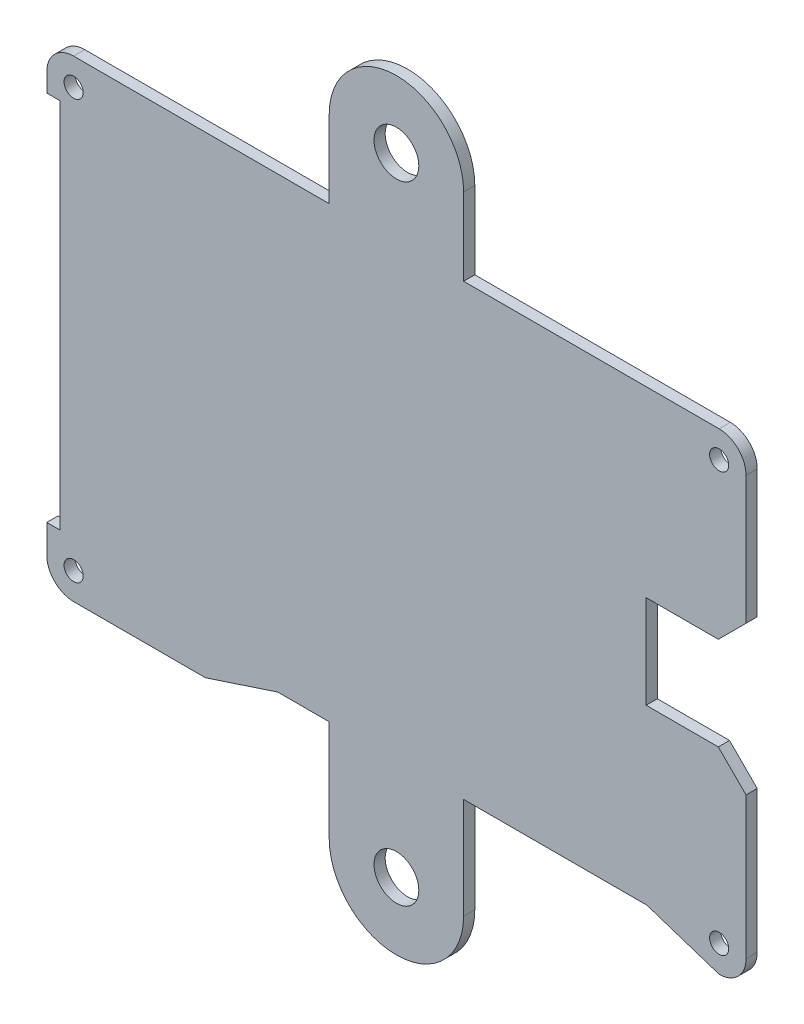
ISO-10303-21;
HEADER;
FILE_DESCRIPTION(('STEP AP214'),'2;1');
FILE_NAME('part.step','',(''),(''),'','','');
FILE_SCHEMA(('AUTOMOTIVE_DESIGN { 1 0 10303 214 1 1 1 1 }'));
ENDSEC;
DATA;
#1=APPLICATION_CONTEXT('core data for automotive mechanical design processes');
#2=APPLICATION_PROTOCOL_DEFINITION('international standard','automotive_design',2000,#1);
#3=PRODUCT_CONTEXT('',#1,'mechanical');
#4=PRODUCT('Part','Part','',(#3));
#5=PRODUCT_RELATED_PRODUCT_CATEGORY('part','',(#4));
#6=PRODUCT_DEFINITION_FORMATION('','',#4);
#7=PRODUCT_DEFINITION_CONTEXT('part definition',#1,'design');
#8=PRODUCT_DEFINITION('design','',#6,#7);
#9=PRODUCT_DEFINITION_SHAPE('','',#8);
#10=(LENGTH_UNIT() NAMED_UNIT(*) SI_UNIT(.MILLI.,.METRE.));
#11=(NAMED_UNIT(*) PLANE_ANGLE_UNIT() SI_UNIT($,.RADIAN.));
#12=(NAMED_UNIT(*) SI_UNIT($,.STERADIAN.) SOLID_ANGLE_UNIT());
#13=UNCERTAINTY_MEASURE_WITH_UNIT(LENGTH_MEASURE(1.E-05),#10,'distance_accuracy_value','');
#14=(GEOMETRIC_REPRESENTATION_CONTEXT(3) GLOBAL_UNCERTAINTY_ASSIGNED_CONTEXT((#13)) GLOBAL_UNIT_ASSIGNED_CONTEXT((#10,
#11,#12)) REPRESENTATION_CONTEXT('',''));
#15=CARTESIAN_POINT('',(0.,0.,0.));
#16=DIRECTION('',(0.,0.,1.));
#17=DIRECTION('',(1.,0.,0.));
#18=AXIS2_PLACEMENT_3D('',#15,#16,#17);
#19=CARTESIAN_POINT('',(-368.3165,91.1883,1.5875));
#20=DIRECTION('',(0.,1.,0.));
#21=DIRECTION('',(-1.,0.,0.));
#22=AXIS2_PLACEMENT_3D('',#19,#20,#21);
#23=PLANE('',#22);
#24=DIRECTION('',(0.,0.,1.));
#25=VECTOR('',#24,1.);
#26=CARTESIAN_POINT('',(-361.0272,91.1883,0.));
#27=LINE('',#26,#25);
#28=CARTESIAN_POINT('',(-361.0272,91.1883,0.));
#29=VERTEX_POINT('',#28);
#30=CARTESIAN_POINT('',(-361.0272,91.1883,1.5875));
#31=VERTEX_POINT('',#30);
#32=EDGE_CURVE('E243',#29,#31,#27,.T.);
#33=ORIENTED_EDGE('',*,*,#32,.T.);
#34=DIRECTION('',(1.,0.,0.));
#35=VECTOR('',#34,1.);
#36=CARTESIAN_POINT('',(-368.3165,91.1883,1.5875));
#37=LINE('',#36,#35);
#38=CARTESIAN_POINT('',(-368.3165,91.1883,1.5875));
#39=VERTEX_POINT('',#38);
#40=EDGE_CURVE('E365',#39,#31,#37,.T.);
#41=ORIENTED_EDGE('',*,*,#40,.F.);
#42=DIRECTION('',(0.,0.,-1.));
#43=VECTOR('',#42,1.);
#44=CARTESIAN_POINT('',(-368.3165,91.1883,1.5875));
#45=LINE('',#44,#43);
#46=CARTESIAN_POINT('',(-368.3165,91.1883,0.));
#47=VERTEX_POINT('',#46);
#48=EDGE_CURVE('E425',#39,#47,#45,.T.);
#49=ORIENTED_EDGE('',*,*,#48,.T.);
#50=DIRECTION('',(1.,0.,0.));
#51=VECTOR('',#50,1.);
#52=CARTESIAN_POINT('',(-368.3165,91.1883,0.));
#53=LINE('',#52,#51);
#54=EDGE_CURVE('E412',#47,#29,#53,.T.);
#55=ORIENTED_EDGE('',*,*,#54,.T.);
#56=EDGE_LOOP('',(#33,#41,#49,#55));
#57=FACE_BOUND('',#56,.T.);
#58=ADVANCED_FACE('F35',(#57),#23,.F.);
#59=CARTESIAN_POINT('',(-305.7573,154.7804,1.5875));
#60=DIRECTION('',(0.,-1.,0.));
#61=DIRECTION('',(1.,0.,0.));
#62=AXIS2_PLACEMENT_3D('',#59,#60,#61);
#63=PLANE('',#62);
#64=DIRECTION('',(0.,0.,1.));
#65=VECTOR('',#64,1.);
#66=CARTESIAN_POINT('',(-361.0272,154.7804,0.));
#67=LINE('',#66,#65);
#68=CARTESIAN_POINT('',(-361.0272,154.7804,0.));
#69=VERTEX_POINT('',#68);
#70=CARTESIAN_POINT('',(-361.0272,154.7804,1.5875));
#71=VERTEX_POINT('',#70);
#72=EDGE_CURVE('E58',#69,#71,#67,.T.);
#73=ORIENTED_EDGE('',*,*,#72,.F.);
#74=DIRECTION('',(-1.,0.,0.));
#75=VECTOR('',#74,1.);
#76=CARTESIAN_POINT('',(-305.7573,154.7804,0.));
#77=LINE('',#76,#75);
#78=CARTESIAN_POINT('',(-397.247125,154.7804,0.));
#79=VERTEX_POINT('',#78);
#80=EDGE_CURVE('E389',#69,#79,#77,.T.);
#81=ORIENTED_EDGE('',*,*,#80,.T.);
#82=DIRECTION('',(0.,0.,-1.));
#83=VECTOR('',#82,1.);
#84=CARTESIAN_POINT('',(-397.247125,154.7804,1.5875));
#85=LINE('',#84,#83);
#86=CARTESIAN_POINT('',(-397.247125,154.7804,1.5875));
#87=VERTEX_POINT('',#86);
#88=EDGE_CURVE('E452',#87,#79,#85,.T.);
#89=ORIENTED_EDGE('',*,*,#88,.F.);
#90=DIRECTION('',(-1.,0.,0.));
#91=VECTOR('',#90,1.);
#92=CARTESIAN_POINT('',(-305.7573,154.7804,1.5875));
#93=LINE('',#92,#91);
#94=EDGE_CURVE('E342',#71,#87,#93,.T.);
#95=ORIENTED_EDGE('',*,*,#94,.F.);
#96=EDGE_LOOP('',(#73,#81,#89,#95));
#97=FACE_BOUND('',#96,.T.);
#98=ADVANCED_FACE('F568',(#97),#63,.F.);
#99=CARTESIAN_POINT('',(-305.7573,150.9704,1.5875));
#100=DIRECTION('',(0.,0.,1.));
#101=DIRECTION('',(1.,0.,0.));
#102=AXIS2_PLACEMENT_3D('',#99,#100,#101);
#103=PLANE('',#102);
#104=CARTESIAN_POINT('',(-397.247125,150.9704,1.5875));
#105=DIRECTION('',(0.,0.,1.));
#106=DIRECTION('',(1.,0.,0.));
#107=AXIS2_PLACEMENT_3D('',#104,#105,#106);
#108=CIRCLE('',#107,1.35590040587868);
#109=CARTESIAN_POINT('',(-395.891224594121,150.9704,1.5875));
#110=VERTEX_POINT('',#109);
#111=EDGE_CURVE('E306',#110,#110,#108,.T.);
#112=ORIENTED_EDGE('',*,*,#111,.F.);
#113=EDGE_LOOP('',(#112));
#114=FACE_BOUND('',#113,.T.);
#115=CARTESIAN_POINT('',(-305.7573,91.6317,1.5875));
#116=DIRECTION('',(0.,0.,1.));
#117=DIRECTION('',(1.,0.,0.));
#118=AXIS2_PLACEMENT_3D('',#115,#116,#117);
#119=CIRCLE('',#118,1.35590040587868);
#120=CARTESIAN_POINT('',(-304.401399594121,91.6317,1.5875));
#121=VERTEX_POINT('',#120);
#122=EDGE_CURVE('E318',#121,#121,#119,.T.);
#123=ORIENTED_EDGE('',*,*,#122,.F.);
#124=EDGE_LOOP('',(#123));
#125=FACE_BOUND('',#124,.T.);
#126=DIRECTION('',(0.,1.,0.));
#127=VECTOR('',#126,1.);
#128=CARTESIAN_POINT('',(-301.9473,91.6317,1.5875));
#129=LINE('',#128,#127);
#130=CARTESIAN_POINT('',(-301.9473,91.6317,1.5875));
#131=VERTEX_POINT('',#130);
#132=CARTESIAN_POINT('',(-301.9473,111.74645,1.5875));
#133=VERTEX_POINT('',#132);
#134=EDGE_CURVE('E324',#131,#133,#129,.T.);
#135=ORIENTED_EDGE('',*,*,#134,.T.);
#136=DIRECTION('',(-0.70710678118655,0.707106781186545,0.));
#137=VECTOR('',#136,1.);
#138=CARTESIAN_POINT('',(-301.9473,111.74645,1.5875));
#139=LINE('',#138,#137);
#140=CARTESIAN_POINT('',(-305.87795,115.6771,1.5875));
#141=VERTEX_POINT('',#140);
#142=EDGE_CURVE('E327',#133,#141,#139,.T.);
#143=ORIENTED_EDGE('',*,*,#142,.T.);
#144=DIRECTION('',(-1.,0.,0.));
#145=VECTOR('',#144,1.);
#146=CARTESIAN_POINT('',(-305.87795,115.6771,1.5875));
#147=LINE('',#146,#145);
#148=CARTESIAN_POINT('',(-316.1078,115.6771,1.5875));
#149=VERTEX_POINT('',#148);
#150=EDGE_CURVE('E330',#141,#149,#147,.T.);
#151=ORIENTED_EDGE('',*,*,#150,.T.);
#152=DIRECTION('',(0.,1.,0.));
#153=VECTOR('',#152,1.);
#154=CARTESIAN_POINT('',(-316.1078,115.6771,1.5875));
#155=LINE('',#154,#153);
#156=CARTESIAN_POINT('',(-316.1078,128.8851,1.5875));
#157=VERTEX_POINT('',#156);
#158=EDGE_CURVE('E332',#149,#157,#155,.T.);
#159=ORIENTED_EDGE('',*,*,#158,.T.);
#160=DIRECTION('',(1.,0.,0.));
#161=VECTOR('',#160,1.);
#162=CARTESIAN_POINT('',(-316.1078,128.8851,1.5875));
#163=LINE('',#162,#161);
#164=CARTESIAN_POINT('',(-305.87795,128.8851,1.5875));
#165=VERTEX_POINT('',#164);
#166=EDGE_CURVE('E334',#157,#165,#163,.T.);
#167=ORIENTED_EDGE('',*,*,#166,.T.);
#168=DIRECTION('',(0.70710678118655,0.707106781186545,0.));
#169=VECTOR('',#168,1.);
#170=CARTESIAN_POINT('',(-305.87795,128.8851,1.5875));
#171=LINE('',#170,#169);
#172=CARTESIAN_POINT('',(-301.9473,132.81575,1.5875));
#173=VERTEX_POINT('',#172);
#174=EDGE_CURVE('E336',#165,#173,#171,.T.);
#175=ORIENTED_EDGE('',*,*,#174,.T.);
#176=DIRECTION('',(0.,1.,0.));
#177=VECTOR('',#176,1.);
#178=CARTESIAN_POINT('',(-301.9473,132.81575,1.5875));
#179=LINE('',#178,#177);
#180=CARTESIAN_POINT('',(-301.9473,150.9704,1.5875));
#181=VERTEX_POINT('',#180);
#182=EDGE_CURVE('E338',#173,#181,#179,.T.);
#183=ORIENTED_EDGE('',*,*,#182,.T.);
#184=CARTESIAN_POINT('',(-305.7573,150.9704,1.5875));
#185=DIRECTION('',(0.,0.,1.));
#186=DIRECTION('',(1.,0.,0.));
#187=AXIS2_PLACEMENT_3D('',#184,#185,#186);
#188=CIRCLE('',#187,3.80999999999994);
#189=CARTESIAN_POINT('',(-305.7573,154.7804,1.5875));
#190=VERTEX_POINT('',#189);
#191=EDGE_CURVE('E340',#181,#190,#188,.T.);
#192=ORIENTED_EDGE('',*,*,#191,.T.);
#193=CARTESIAN_POINT('',(-341.9772,154.7804,1.5875));
#194=VERTEX_POINT('',#193);
#195=EDGE_CURVE('E343',#190,#194,#93,.T.);
#196=ORIENTED_EDGE('',*,*,#195,.T.);
#197=DIRECTION('',(0.,1.,0.));
#198=VECTOR('',#197,1.);
#199=CARTESIAN_POINT('',(-341.9772,0.,1.5875));
#200=LINE('',#199,#198);
#201=CARTESIAN_POINT('',(-341.9772,165.75105,1.5875));
#202=VERTEX_POINT('',#201);
#203=EDGE_CURVE('E285',#194,#202,#200,.T.);
#204=ORIENTED_EDGE('',*,*,#203,.T.);
#205=CARTESIAN_POINT('',(-351.5022,165.75105,1.5875));
#206=DIRECTION('',(0.,0.,1.));
#207=DIRECTION('',(1.,0.,0.));
#208=AXIS2_PLACEMENT_3D('',#205,#206,#207);
#209=CIRCLE('',#208,9.52500000000001);
#210=CARTESIAN_POINT('',(-361.0272,165.75105,1.5875));
#211=VERTEX_POINT('',#210);
#212=EDGE_CURVE('E288',#202,#211,#209,.T.);
#213=ORIENTED_EDGE('',*,*,#212,.T.);
#214=DIRECTION('',(0.,1.,0.));
#215=VECTOR('',#214,1.);
#216=CARTESIAN_POINT('',(-361.0272,0.,1.5875));
#217=LINE('',#216,#215);
#218=EDGE_CURVE('E274',#71,#211,#217,.T.);
#219=ORIENTED_EDGE('',*,*,#218,.F.);
#220=ORIENTED_EDGE('',*,*,#94,.T.);
#221=CARTESIAN_POINT('',(-397.247125,150.9704,1.5875));
#222=DIRECTION('',(0.,0.,1.));
#223=DIRECTION('',(1.,0.,0.));
#224=AXIS2_PLACEMENT_3D('',#221,#222,#223);
#225=CIRCLE('',#224,3.81000000000001);
#226=CARTESIAN_POINT('',(-401.0571,150.956597848903,1.5875));
#227=VERTEX_POINT('',#226);
#228=EDGE_CURVE('E346',#87,#227,#225,.T.);
#229=ORIENTED_EDGE('',*,*,#228,.T.);
#230=DIRECTION('',(0.,-1.,0.));
#231=VECTOR('',#230,1.);
#232=CARTESIAN_POINT('',(-401.0571,150.956597848903,1.5875));
#233=LINE('',#232,#231);
#234=CARTESIAN_POINT('',(-401.0571,148.341,1.5875));
#235=VERTEX_POINT('',#234);
#236=EDGE_CURVE('E348',#227,#235,#233,.T.);
#237=ORIENTED_EDGE('',*,*,#236,.T.);
#238=DIRECTION('',(1.,0.,0.));
#239=VECTOR('',#238,1.);
#240=CARTESIAN_POINT('',(-401.0571,148.341,1.5875));
#241=LINE('',#240,#239);
#242=CARTESIAN_POINT('',(-399.1521,148.341,1.5875));
#243=VERTEX_POINT('',#242);
#244=EDGE_CURVE('E350',#235,#243,#241,.T.);
#245=ORIENTED_EDGE('',*,*,#244,.T.);
#246=DIRECTION('',(0.,-1.,0.));
#247=VECTOR('',#246,1.);
#248=CARTESIAN_POINT('',(-399.1521,148.341,1.5875));
#249=LINE('',#248,#247);
#250=CARTESIAN_POINT('',(-399.1521,95.6449,1.5875));
#251=VERTEX_POINT('',#250);
#252=EDGE_CURVE('E352',#243,#251,#249,.T.);
#253=ORIENTED_EDGE('',*,*,#252,.T.);
#254=DIRECTION('',(-1.,0.,0.));
#255=VECTOR('',#254,1.);
#256=CARTESIAN_POINT('',(-399.1521,95.6449,1.5875));
#257=LINE('',#256,#255);
#258=CARTESIAN_POINT('',(-401.0571,95.6449,1.5875));
#259=VERTEX_POINT('',#258);
#260=EDGE_CURVE('E354',#251,#259,#257,.T.);
#261=ORIENTED_EDGE('',*,*,#260,.T.);
#262=DIRECTION('',(0.,-1.,0.));
#263=VECTOR('',#262,1.);
#264=CARTESIAN_POINT('',(-401.0571,95.6449,1.5875));
#265=LINE('',#264,#263);
#266=CARTESIAN_POINT('',(-401.0571,91.6593041663556,1.5875));
#267=VERTEX_POINT('',#266);
#268=EDGE_CURVE('E356',#259,#267,#265,.T.);
#269=ORIENTED_EDGE('',*,*,#268,.T.);
#270=CARTESIAN_POINT('',(-397.2472,91.6317,1.5875));
#271=DIRECTION('',(0.,0.,1.));
#272=DIRECTION('',(1.,0.,0.));
#273=AXIS2_PLACEMENT_3D('',#270,#271,#272);
#274=CIRCLE('',#273,3.81);
#275=CARTESIAN_POINT('',(-397.2472,87.8217,1.5875));
#276=VERTEX_POINT('',#275);
#277=EDGE_CURVE('E358',#267,#276,#274,.T.);
#278=ORIENTED_EDGE('',*,*,#277,.T.);
#279=DIRECTION('',(1.,0.,0.));
#280=VECTOR('',#279,1.);
#281=CARTESIAN_POINT('',(-397.2472,87.8217,1.5875));
#282=LINE('',#281,#280);
#283=CARTESIAN_POINT('',(-378.5565,87.8217,1.5875));
#284=VERTEX_POINT('',#283);
#285=EDGE_CURVE('E360',#276,#284,#282,.T.);
#286=ORIENTED_EDGE('',*,*,#285,.T.);
#287=DIRECTION('',(0.949975924247208,0.312323139313538,0.));
#288=VECTOR('',#287,1.);
#289=CARTESIAN_POINT('',(-378.5565,87.8217,1.5875));
#290=LINE('',#289,#288);
#291=EDGE_CURVE('E362',#284,#39,#290,.T.);
#292=ORIENTED_EDGE('',*,*,#291,.T.);
#293=ORIENTED_EDGE('',*,*,#40,.T.);
#294=DIRECTION('',(0.,1.,0.));
#295=VECTOR('',#294,1.);
#296=CARTESIAN_POINT('',(-361.0272,0.,1.5875));
#297=LINE('',#296,#295);
#298=CARTESIAN_POINT('',(-361.0272,76.85105,1.5875));
#299=VERTEX_POINT('',#298);
#300=EDGE_CURVE('E261',#299,#31,#297,.T.);
#301=ORIENTED_EDGE('',*,*,#300,.F.);
#302=CARTESIAN_POINT('',(-351.5022,76.85105,1.5875));
#303=DIRECTION('',(0.,0.,1.));
#304=DIRECTION('',(1.,0.,0.));
#305=AXIS2_PLACEMENT_3D('',#302,#303,#304);
#306=CIRCLE('',#305,9.52500000000001);
#307=CARTESIAN_POINT('',(-341.9772,76.85105,1.5875));
#308=VERTEX_POINT('',#307);
#309=EDGE_CURVE('E233',#299,#308,#306,.T.);
#310=ORIENTED_EDGE('',*,*,#309,.T.);
#311=DIRECTION('',(0.,1.,0.));
#312=VECTOR('',#311,1.);
#313=CARTESIAN_POINT('',(-341.9772,0.,1.5875));
#314=LINE('',#313,#312);
#315=CARTESIAN_POINT('',(-341.9772,91.1883,1.5875));
#316=VERTEX_POINT('',#315);
#317=EDGE_CURVE('E50',#308,#316,#314,.T.);
#318=ORIENTED_EDGE('',*,*,#317,.T.);
#319=CARTESIAN_POINT('',(-315.9973,91.1883,1.5875));
#320=VERTEX_POINT('',#319);
#321=EDGE_CURVE('E364',#316,#320,#37,.T.);
#322=ORIENTED_EDGE('',*,*,#321,.T.);
#323=DIRECTION('',(0.949975924247207,-0.312323139313541,0.));
#324=VECTOR('',#323,1.);
#325=CARTESIAN_POINT('',(-315.9973,91.1883,1.5875));
#326=LINE('',#325,#324);
#327=CARTESIAN_POINT('',(-305.7573,87.8217,1.5875));
#328=VERTEX_POINT('',#327);
#329=EDGE_CURVE('E368',#320,#328,#326,.T.);
#330=ORIENTED_EDGE('',*,*,#329,.T.);
#331=CARTESIAN_POINT('',(-305.7573,91.6317,1.5875));
#332=DIRECTION('',(0.,0.,1.));
#333=DIRECTION('',(1.,0.,0.));
#334=AXIS2_PLACEMENT_3D('',#331,#332,#333);
#335=CIRCLE('',#334,3.81);
#336=EDGE_CURVE('E370',#328,#131,#335,.T.);
#337=ORIENTED_EDGE('',*,*,#336,.T.);
#338=EDGE_LOOP('',(#135,#143,#151,#159,#167,#175,#183,#192,#196,#204,#213,#219,#220,#229,#237,
#245,#253,#261,#269,#278,#286,#292,#293,#301,#310,#318,#322,#330,#337));
#339=FACE_BOUND('',#338,.T.);
#340=CARTESIAN_POINT('',(-305.7573,150.9704,1.5875));
#341=DIRECTION('',(0.,0.,1.));
#342=DIRECTION('',(1.,0.,0.));
#343=AXIS2_PLACEMENT_3D('',#340,#341,#342);
#344=CIRCLE('',#343,1.35590040587868);
#345=CARTESIAN_POINT('',(-304.401399594121,150.9704,1.5875));
#346=VERTEX_POINT('',#345);
#347=EDGE_CURVE('E312',#346,#346,#344,.T.);
#348=ORIENTED_EDGE('',*,*,#347,.F.);
#349=EDGE_LOOP('',(#348));
#350=FACE_BOUND('',#349,.T.);
#351=CARTESIAN_POINT('',(-397.2472,91.6317,1.5875));
#352=DIRECTION('',(0.,0.,1.));
#353=DIRECTION('',(1.,0.,0.));
#354=AXIS2_PLACEMENT_3D('',#351,#352,#353);
#355=CIRCLE('',#354,1.35590040587868);
#356=CARTESIAN_POINT('',(-395.891299594121,91.6317,1.5875));
#357=VERTEX_POINT('',#356);
#358=EDGE_CURVE('E300',#357,#357,#355,.T.);
#359=ORIENTED_EDGE('',*,*,#358,.F.);
#360=EDGE_LOOP('',(#359));
#361=FACE_BOUND('',#360,.T.);
#362=CARTESIAN_POINT('',(-351.5022,165.75105,1.5875));
#363=DIRECTION('',(0.,0.,1.));
#364=DIRECTION('',(1.,0.,0.));
#365=AXIS2_PLACEMENT_3D('',#362,#363,#364);
#366=CIRCLE('',#365,3.17499999999997);
#367=CARTESIAN_POINT('',(-348.3272,165.75105,1.5875));
#368=VERTEX_POINT('',#367);
#369=EDGE_CURVE('E266',#368,#368,#366,.T.);
#370=ORIENTED_EDGE('',*,*,#369,.F.);
#371=EDGE_LOOP('',(#370));
#372=FACE_BOUND('',#371,.T.);
#373=CARTESIAN_POINT('',(-351.5022,76.85105,1.5875));
#374=DIRECTION('',(0.,0.,1.));
#375=DIRECTION('',(1.,0.,0.));
#376=AXIS2_PLACEMENT_3D('',#373,#374,#375);
#377=CIRCLE('',#376,3.17499999999997);
#378=CARTESIAN_POINT('',(-348.3272,76.85105,1.5875));
#379=VERTEX_POINT('',#378);
#380=EDGE_CURVE('E258',#379,#379,#377,.T.);
#381=ORIENTED_EDGE('',*,*,#380,.F.);
#382=EDGE_LOOP('',(#381));
#383=FACE_BOUND('',#382,.T.);
#384=ADVANCED_FACE('F492',(#114,#125,#339,#350,#361,#372,#383),#103,.T.);
#385=CARTESIAN_POINT('',(-305.7573,150.9704,0.));
#386=DIRECTION('',(0.,0.,1.));
#387=DIRECTION('',(1.,0.,0.));
#388=AXIS2_PLACEMENT_3D('',#385,#386,#387);
#389=PLANE('',#388);
#390=CARTESIAN_POINT('',(-397.247125,150.9704,0.));
#391=DIRECTION('',(0.,0.,1.));
#392=DIRECTION('',(1.,0.,0.));
#393=AXIS2_PLACEMENT_3D('',#390,#391,#392);
#394=CIRCLE('',#393,1.35590040587868);
#395=CARTESIAN_POINT('',(-395.891224594121,150.9704,0.));
#396=VERTEX_POINT('',#395);
#397=EDGE_CURVE('E303',#396,#396,#394,.T.);
#398=ORIENTED_EDGE('',*,*,#397,.T.);
#399=EDGE_LOOP('',(#398));
#400=FACE_BOUND('',#399,.T.);
#401=CARTESIAN_POINT('',(-305.7573,91.6317,0.));
#402=DIRECTION('',(0.,0.,1.));
#403=DIRECTION('',(1.,0.,0.));
#404=AXIS2_PLACEMENT_3D('',#401,#402,#403);
#405=CIRCLE('',#404,1.35590040587868);
#406=CARTESIAN_POINT('',(-304.401399594121,91.6317,0.));
#407=VERTEX_POINT('',#406);
#408=EDGE_CURVE('E315',#407,#407,#405,.T.);
#409=ORIENTED_EDGE('',*,*,#408,.T.);
#410=EDGE_LOOP('',(#409));
#411=FACE_BOUND('',#410,.T.);
#412=DIRECTION('',(0.,1.,0.));
#413=VECTOR('',#412,1.);
#414=CARTESIAN_POINT('',(-301.9473,91.6317,0.));
#415=LINE('',#414,#413);
#416=CARTESIAN_POINT('',(-301.9473,91.6317,0.));
#417=VERTEX_POINT('',#416);
#418=CARTESIAN_POINT('',(-301.9473,111.74645,0.));
#419=VERTEX_POINT('',#418);
#420=EDGE_CURVE('E321',#417,#419,#415,.T.);
#421=ORIENTED_EDGE('',*,*,#420,.F.);
#422=CARTESIAN_POINT('',(-305.7573,91.6317,0.));
#423=DIRECTION('',(0.,0.,1.));
#424=DIRECTION('',(1.,0.,0.));
#425=AXIS2_PLACEMENT_3D('',#422,#423,#424);
#426=CIRCLE('',#425,3.81);
#427=CARTESIAN_POINT('',(-305.7573,87.8217,0.));
#428=VERTEX_POINT('',#427);
#429=EDGE_CURVE('E328',#428,#417,#426,.T.);
#430=ORIENTED_EDGE('',*,*,#429,.F.);
#431=DIRECTION('',(0.949975924247207,-0.312323139313541,0.));
#432=VECTOR('',#431,1.);
#433=CARTESIAN_POINT('',(-315.9973,91.1883,0.));
#434=LINE('',#433,#432);
#435=CARTESIAN_POINT('',(-315.9973,91.1883,0.));
#436=VERTEX_POINT('',#435);
#437=EDGE_CURVE('E414',#436,#428,#434,.T.);
#438=ORIENTED_EDGE('',*,*,#437,.F.);
#439=CARTESIAN_POINT('',(-341.9772,91.1883,0.));
#440=VERTEX_POINT('',#439);
#441=EDGE_CURVE('E411',#440,#436,#53,.T.);
#442=ORIENTED_EDGE('',*,*,#441,.F.);
#443=DIRECTION('',(0.,1.,0.));
#444=VECTOR('',#443,1.);
#445=CARTESIAN_POINT('',(-341.9772,0.,0.));
#446=LINE('',#445,#444);
#447=CARTESIAN_POINT('',(-341.9772,76.85105,0.));
#448=VERTEX_POINT('',#447);
#449=EDGE_CURVE('E237',#448,#440,#446,.T.);
#450=ORIENTED_EDGE('',*,*,#449,.F.);
#451=CARTESIAN_POINT('',(-351.5022,76.85105,0.));
#452=DIRECTION('',(0.,0.,1.));
#453=DIRECTION('',(1.,0.,0.));
#454=AXIS2_PLACEMENT_3D('',#451,#452,#453);
#455=CIRCLE('',#454,9.52500000000001);
#456=CARTESIAN_POINT('',(-361.0272,76.85105,0.));
#457=VERTEX_POINT('',#456);
#458=EDGE_CURVE('E232',#457,#448,#455,.T.);
#459=ORIENTED_EDGE('',*,*,#458,.F.);
#460=DIRECTION('',(0.,1.,0.));
#461=VECTOR('',#460,1.);
#462=CARTESIAN_POINT('',(-361.0272,0.,0.));
#463=LINE('',#462,#461);
#464=EDGE_CURVE('E240',#457,#29,#463,.T.);
#465=ORIENTED_EDGE('',*,*,#464,.T.);
#466=ORIENTED_EDGE('',*,*,#54,.F.);
#467=DIRECTION('',(0.949975924247208,0.312323139313538,0.));
#468=VECTOR('',#467,1.);
#469=CARTESIAN_POINT('',(-378.5565,87.8217,0.));
#470=LINE('',#469,#468);
#471=CARTESIAN_POINT('',(-378.5565,87.8217,0.));
#472=VERTEX_POINT('',#471);
#473=EDGE_CURVE('E409',#472,#47,#470,.T.);
#474=ORIENTED_EDGE('',*,*,#473,.F.);
#475=DIRECTION('',(1.,0.,0.));
#476=VECTOR('',#475,1.);
#477=CARTESIAN_POINT('',(-397.2472,87.8217,0.));
#478=LINE('',#477,#476);
#479=CARTESIAN_POINT('',(-397.2472,87.8217,0.));
#480=VERTEX_POINT('',#479);
#481=EDGE_CURVE('E407',#480,#472,#478,.T.);
#482=ORIENTED_EDGE('',*,*,#481,.F.);
#483=CARTESIAN_POINT('',(-397.2472,91.6317,0.));
#484=DIRECTION('',(0.,0.,1.));
#485=DIRECTION('',(1.,0.,0.));
#486=AXIS2_PLACEMENT_3D('',#483,#484,#485);
#487=CIRCLE('',#486,3.81);
#488=CARTESIAN_POINT('',(-401.0571,91.6593041663556,0.));
#489=VERTEX_POINT('',#488);
#490=EDGE_CURVE('E405',#489,#480,#487,.T.);
#491=ORIENTED_EDGE('',*,*,#490,.F.);
#492=DIRECTION('',(0.,-1.,0.));
#493=VECTOR('',#492,1.);
#494=CARTESIAN_POINT('',(-401.0571,95.6449,0.));
#495=LINE('',#494,#493);
#496=CARTESIAN_POINT('',(-401.0571,95.6449,0.));
#497=VERTEX_POINT('',#496);
#498=EDGE_CURVE('E403',#497,#489,#495,.T.);
#499=ORIENTED_EDGE('',*,*,#498,.F.);
#500=DIRECTION('',(-1.,0.,0.));
#501=VECTOR('',#500,1.);
#502=CARTESIAN_POINT('',(-399.1521,95.6449,0.));
#503=LINE('',#502,#501);
#504=CARTESIAN_POINT('',(-399.1521,95.6449,0.));
#505=VERTEX_POINT('',#504);
#506=EDGE_CURVE('E401',#505,#497,#503,.T.);
#507=ORIENTED_EDGE('',*,*,#506,.F.);
#508=DIRECTION('',(0.,-1.,0.));
#509=VECTOR('',#508,1.);
#510=CARTESIAN_POINT('',(-399.1521,148.341,0.));
#511=LINE('',#510,#509);
#512=CARTESIAN_POINT('',(-399.1521,148.341,0.));
#513=VERTEX_POINT('',#512);
#514=EDGE_CURVE('E399',#513,#505,#511,.T.);
#515=ORIENTED_EDGE('',*,*,#514,.F.);
#516=DIRECTION('',(1.,0.,0.));
#517=VECTOR('',#516,1.);
#518=CARTESIAN_POINT('',(-401.0571,148.341,0.));
#519=LINE('',#518,#517);
#520=CARTESIAN_POINT('',(-401.0571,148.341,0.));
#521=VERTEX_POINT('',#520);
#522=EDGE_CURVE('E397',#521,#513,#519,.T.);
#523=ORIENTED_EDGE('',*,*,#522,.F.);
#524=DIRECTION('',(0.,-1.,0.));
#525=VECTOR('',#524,1.);
#526=CARTESIAN_POINT('',(-401.0571,150.956597848903,0.));
#527=LINE('',#526,#525);
#528=CARTESIAN_POINT('',(-401.0571,150.956597848903,0.));
#529=VERTEX_POINT('',#528);
#530=EDGE_CURVE('E395',#529,#521,#527,.T.);
#531=ORIENTED_EDGE('',*,*,#530,.F.);
#532=CARTESIAN_POINT('',(-397.247125,150.9704,0.));
#533=DIRECTION('',(0.,0.,1.));
#534=DIRECTION('',(1.,0.,0.));
#535=AXIS2_PLACEMENT_3D('',#532,#533,#534);
#536=CIRCLE('',#535,3.81000000000001);
#537=EDGE_CURVE('E393',#79,#529,#536,.T.);
#538=ORIENTED_EDGE('',*,*,#537,.F.);
#539=ORIENTED_EDGE('',*,*,#80,.F.);
#540=DIRECTION('',(0.,1.,0.));
#541=VECTOR('',#540,1.);
#542=CARTESIAN_POINT('',(-361.0272,0.,0.));
#543=LINE('',#542,#541);
#544=CARTESIAN_POINT('',(-361.0272,165.75105,0.));
#545=VERTEX_POINT('',#544);
#546=EDGE_CURVE('E280',#69,#545,#543,.T.);
#547=ORIENTED_EDGE('',*,*,#546,.T.);
#548=CARTESIAN_POINT('',(-351.5022,165.75105,0.));
#549=DIRECTION('',(0.,0.,1.));
#550=DIRECTION('',(1.,0.,0.));
#551=AXIS2_PLACEMENT_3D('',#548,#549,#550);
#552=CIRCLE('',#551,9.52500000000001);
#553=CARTESIAN_POINT('',(-341.9772,165.75105,0.));
#554=VERTEX_POINT('',#553);
#555=EDGE_CURVE('E277',#554,#545,#552,.T.);
#556=ORIENTED_EDGE('',*,*,#555,.F.);
#557=DIRECTION('',(0.,1.,0.));
#558=VECTOR('',#557,1.);
#559=CARTESIAN_POINT('',(-341.9772,0.,0.));
#560=LINE('',#559,#558);
#561=CARTESIAN_POINT('',(-341.9772,154.7804,0.));
#562=VERTEX_POINT('',#561);
#563=EDGE_CURVE('E273',#562,#554,#560,.T.);
#564=ORIENTED_EDGE('',*,*,#563,.F.);
#565=CARTESIAN_POINT('',(-305.7573,154.7804,0.));
#566=VERTEX_POINT('',#565);
#567=EDGE_CURVE('E390',#566,#562,#77,.T.);
#568=ORIENTED_EDGE('',*,*,#567,.F.);
#569=CARTESIAN_POINT('',(-305.7573,150.9704,0.));
#570=DIRECTION('',(0.,0.,1.));
#571=DIRECTION('',(1.,0.,0.));
#572=AXIS2_PLACEMENT_3D('',#569,#570,#571);
#573=CIRCLE('',#572,3.80999999999994);
#574=CARTESIAN_POINT('',(-301.9473,150.9704,0.));
#575=VERTEX_POINT('',#574);
#576=EDGE_CURVE('E387',#575,#566,#573,.T.);
#577=ORIENTED_EDGE('',*,*,#576,.F.);
#578=DIRECTION('',(0.,1.,0.));
#579=VECTOR('',#578,1.);
#580=CARTESIAN_POINT('',(-301.9473,132.81575,0.));
#581=LINE('',#580,#579);
#582=CARTESIAN_POINT('',(-301.9473,132.81575,0.));
#583=VERTEX_POINT('',#582);
#584=EDGE_CURVE('E385',#583,#575,#581,.T.);
#585=ORIENTED_EDGE('',*,*,#584,.F.);
#586=DIRECTION('',(0.70710678118655,0.707106781186545,0.));
#587=VECTOR('',#586,1.);
#588=CARTESIAN_POINT('',(-305.87795,128.8851,0.));
#589=LINE('',#588,#587);
#590=CARTESIAN_POINT('',(-305.87795,128.8851,0.));
#591=VERTEX_POINT('',#590);
#592=EDGE_CURVE('E383',#591,#583,#589,.T.);
#593=ORIENTED_EDGE('',*,*,#592,.F.);
#594=DIRECTION('',(1.,0.,0.));
#595=VECTOR('',#594,1.);
#596=CARTESIAN_POINT('',(-316.1078,128.8851,0.));
#597=LINE('',#596,#595);
#598=CARTESIAN_POINT('',(-316.1078,128.8851,0.));
#599=VERTEX_POINT('',#598);
#600=EDGE_CURVE('E381',#599,#591,#597,.T.);
#601=ORIENTED_EDGE('',*,*,#600,.F.);
#602=DIRECTION('',(0.,1.,0.));
#603=VECTOR('',#602,1.);
#604=CARTESIAN_POINT('',(-316.1078,115.6771,0.));
#605=LINE('',#604,#603);
#606=CARTESIAN_POINT('',(-316.1078,115.6771,0.));
#607=VERTEX_POINT('',#606);
#608=EDGE_CURVE('E379',#607,#599,#605,.T.);
#609=ORIENTED_EDGE('',*,*,#608,.F.);
#610=DIRECTION('',(-1.,0.,0.));
#611=VECTOR('',#610,1.);
#612=CARTESIAN_POINT('',(-305.87795,115.6771,0.));
#613=LINE('',#612,#611);
#614=CARTESIAN_POINT('',(-305.87795,115.6771,0.));
#615=VERTEX_POINT('',#614);
#616=EDGE_CURVE('E377',#615,#607,#613,.T.);
#617=ORIENTED_EDGE('',*,*,#616,.F.);
#618=DIRECTION('',(-0.70710678118655,0.707106781186545,0.));
#619=VECTOR('',#618,1.);
#620=CARTESIAN_POINT('',(-301.9473,111.74645,0.));
#621=LINE('',#620,#619);
#622=EDGE_CURVE('E375',#419,#615,#621,.T.);
#623=ORIENTED_EDGE('',*,*,#622,.F.);
#624=EDGE_LOOP('',(#421,#430,#438,#442,#450,#459,#465,#466,#474,#482,#491,#499,#507,#515,#523,
#531,#538,#539,#547,#556,#564,#568,#577,#585,#593,#601,#609,#617,#623));
#625=FACE_BOUND('',#624,.T.);
#626=CARTESIAN_POINT('',(-305.7573,150.9704,0.));
#627=DIRECTION('',(0.,0.,1.));
#628=DIRECTION('',(1.,0.,0.));
#629=AXIS2_PLACEMENT_3D('',#626,#627,#628);
#630=CIRCLE('',#629,1.35590040587868);
#631=CARTESIAN_POINT('',(-304.401399594121,150.9704,0.));
#632=VERTEX_POINT('',#631);
#633=EDGE_CURVE('E309',#632,#632,#630,.T.);
#634=ORIENTED_EDGE('',*,*,#633,.T.);
#635=EDGE_LOOP('',(#634));
#636=FACE_BOUND('',#635,.T.);
#637=CARTESIAN_POINT('',(-397.2472,91.6317,0.));
#638=DIRECTION('',(0.,0.,1.));
#639=DIRECTION('',(1.,0.,0.));
#640=AXIS2_PLACEMENT_3D('',#637,#638,#639);
#641=CIRCLE('',#640,1.35590040587868);
#642=CARTESIAN_POINT('',(-395.891299594121,91.6317,0.));
#643=VERTEX_POINT('',#642);
#644=EDGE_CURVE('E295',#643,#643,#641,.T.);
#645=ORIENTED_EDGE('',*,*,#644,.T.);
#646=EDGE_LOOP('',(#645));
#647=FACE_BOUND('',#646,.T.);
#648=CARTESIAN_POINT('',(-351.5022,165.75105,0.));
#649=DIRECTION('',(0.,0.,1.));
#650=DIRECTION('',(1.,0.,0.));
#651=AXIS2_PLACEMENT_3D('',#648,#649,#650);
#652=CIRCLE('',#651,3.17499999999997);
#653=CARTESIAN_POINT('',(-348.3272,165.75105,0.));
#654=VERTEX_POINT('',#653);
#655=EDGE_CURVE('E270',#654,#654,#652,.T.);
#656=ORIENTED_EDGE('',*,*,#655,.T.);
#657=EDGE_LOOP('',(#656));
#658=FACE_BOUND('',#657,.T.);
#659=CARTESIAN_POINT('',(-351.5022,76.85105,0.));
#660=DIRECTION('',(0.,0.,1.));
#661=DIRECTION('',(1.,0.,0.));
#662=AXIS2_PLACEMENT_3D('',#659,#660,#661);
#663=CIRCLE('',#662,3.17499999999997);
#664=CARTESIAN_POINT('',(-348.3272,76.85105,0.));
#665=VERTEX_POINT('',#664);
#666=EDGE_CURVE('E247',#665,#665,#663,.T.);
#667=ORIENTED_EDGE('',*,*,#666,.T.);
#668=EDGE_LOOP('',(#667));
#669=FACE_BOUND('',#668,.T.);
#670=ADVANCED_FACE('F251',(#400,#411,#625,#636,#647,#658,#669),#389,.F.);
#671=CARTESIAN_POINT('',(-301.9473,91.6317,1.5875));
#672=DIRECTION('',(-1.,0.,0.));
#673=DIRECTION('',(0.,-1.,0.));
#674=AXIS2_PLACEMENT_3D('',#671,#672,#673);
#675=PLANE('',#674);
#676=ORIENTED_EDGE('',*,*,#420,.T.);
#677=DIRECTION('',(0.,0.,-1.));
#678=VECTOR('',#677,1.);
#679=CARTESIAN_POINT('',(-301.9473,111.74645,1.5875));
#680=LINE('',#679,#678);
#681=EDGE_CURVE('E11',#133,#419,#680,.T.);
#682=ORIENTED_EDGE('',*,*,#681,.F.);
#683=ORIENTED_EDGE('',*,*,#134,.F.);
#684=DIRECTION('',(0.,0.,-1.));
#685=VECTOR('',#684,1.);
#686=CARTESIAN_POINT('',(-301.9473,91.6317,1.5875));
#687=LINE('',#686,#685);
#688=EDGE_CURVE('E372',#131,#417,#687,.T.);
#689=ORIENTED_EDGE('',*,*,#688,.T.);
#690=EDGE_LOOP('',(#676,#682,#683,#689));
#691=FACE_BOUND('',#690,.T.);
#692=ADVANCED_FACE('F37',(#691),#675,.F.);
#693=CARTESIAN_POINT('',(-301.9473,111.74645,1.5875));
#694=DIRECTION('',(-0.707106781186545,-0.70710678118655,0.));
#695=DIRECTION('',(0.70710678118655,-0.707106781186545,0.));
#696=AXIS2_PLACEMENT_3D('',#693,#694,#695);
#697=PLANE('',#696);
#698=ORIENTED_EDGE('',*,*,#622,.T.);
#699=DIRECTION('',(0.,0.,-1.));
#700=VECTOR('',#699,1.);
#701=CARTESIAN_POINT('',(-305.87795,115.6771,1.5875));
#702=LINE('',#701,#700);
#703=EDGE_CURVE('E43',#141,#615,#702,.T.);
#704=ORIENTED_EDGE('',*,*,#703,.F.);
#705=ORIENTED_EDGE('',*,*,#142,.F.);
#706=ORIENTED_EDGE('',*,*,#681,.T.);
#707=EDGE_LOOP('',(#698,#704,#705,#706));
#708=FACE_BOUND('',#707,.T.);
#709=ADVANCED_FACE('F497',(#708),#697,.F.);
#710=CARTESIAN_POINT('',(-305.87795,115.6771,1.5875));
#711=DIRECTION('',(0.,-1.,0.));
#712=DIRECTION('',(0.,0.,-1.));
#713=AXIS2_PLACEMENT_3D('',#710,#711,#712);
#714=PLANE('',#713);
#715=ORIENTED_EDGE('',*,*,#616,.T.);
#716=DIRECTION('',(0.,0.,-1.));
#717=VECTOR('',#716,1.);
#718=CARTESIAN_POINT('',(-316.1078,115.6771,1.5875));
#719=LINE('',#718,#717);
#720=EDGE_CURVE('E470',#149,#607,#719,.T.);
#721=ORIENTED_EDGE('',*,*,#720,.F.);
#722=ORIENTED_EDGE('',*,*,#150,.F.);
#723=ORIENTED_EDGE('',*,*,#703,.T.);
#724=EDGE_LOOP('',(#715,#721,#722,#723));
#725=FACE_BOUND('',#724,.T.);
#726=ADVANCED_FACE('F477',(#725),#714,.F.);
#727=CARTESIAN_POINT('',(-316.1078,115.6771,1.5875));
#728=DIRECTION('',(-1.,0.,0.));
#729=DIRECTION('',(0.,0.,1.));
#730=AXIS2_PLACEMENT_3D('',#727,#728,#729);
#731=PLANE('',#730);
#732=ORIENTED_EDGE('',*,*,#608,.T.);
#733=DIRECTION('',(0.,0.,-1.));
#734=VECTOR('',#733,1.);
#735=CARTESIAN_POINT('',(-316.1078,128.8851,1.5875));
#736=LINE('',#735,#734);
#737=EDGE_CURVE('E467',#157,#599,#736,.T.);
#738=ORIENTED_EDGE('',*,*,#737,.F.);
#739=ORIENTED_EDGE('',*,*,#158,.F.);
#740=ORIENTED_EDGE('',*,*,#720,.T.);
#741=EDGE_LOOP('',(#732,#738,#739,#740));
#742=FACE_BOUND('',#741,.T.);
#743=ADVANCED_FACE('F485',(#742),#731,.F.);
#744=CARTESIAN_POINT('',(-316.1078,128.8851,1.5875));
#745=DIRECTION('',(0.,1.,0.));
#746=DIRECTION('',(0.,0.,1.));
#747=AXIS2_PLACEMENT_3D('',#744,#745,#746);
#748=PLANE('',#747);
#749=ORIENTED_EDGE('',*,*,#600,.T.);
#750=DIRECTION('',(0.,0.,-1.));
#751=VECTOR('',#750,1.);
#752=CARTESIAN_POINT('',(-305.87795,128.8851,1.5875));
#753=LINE('',#752,#751);
#754=EDGE_CURVE('E464',#165,#591,#753,.T.);
#755=ORIENTED_EDGE('',*,*,#754,.F.);
#756=ORIENTED_EDGE('',*,*,#166,.F.);
#757=ORIENTED_EDGE('',*,*,#737,.T.);
#758=EDGE_LOOP('',(#749,#755,#756,#757));
#759=FACE_BOUND('',#758,.T.);
#760=ADVANCED_FACE('F489',(#759),#748,.F.);
#761=CARTESIAN_POINT('',(-305.87795,128.8851,1.5875));
#762=DIRECTION('',(-0.707106781186545,0.70710678118655,0.));
#763=DIRECTION('',(-0.70710678118655,-0.707106781186545,0.));
#764=AXIS2_PLACEMENT_3D('',#761,#762,#763);
#765=PLANE('',#764);
#766=ORIENTED_EDGE('',*,*,#592,.T.);
#767=DIRECTION('',(0.,0.,-1.));
#768=VECTOR('',#767,1.);
#769=CARTESIAN_POINT('',(-301.9473,132.81575,1.5875));
#770=LINE('',#769,#768);
#771=EDGE_CURVE('E461',#173,#583,#770,.T.);
#772=ORIENTED_EDGE('',*,*,#771,.F.);
#773=ORIENTED_EDGE('',*,*,#174,.F.);
#774=ORIENTED_EDGE('',*,*,#754,.T.);
#775=EDGE_LOOP('',(#766,#772,#773,#774));
#776=FACE_BOUND('',#775,.T.);
#777=ADVANCED_FACE('F592',(#776),#765,.F.);
#778=CARTESIAN_POINT('',(-301.9473,132.81575,1.5875));
#779=DIRECTION('',(-1.,0.,0.));
#780=DIRECTION('',(0.,0.,1.));
#781=AXIS2_PLACEMENT_3D('',#778,#779,#780);
#782=PLANE('',#781);
#783=ORIENTED_EDGE('',*,*,#584,.T.);
#784=DIRECTION('',(0.,0.,-1.));
#785=VECTOR('',#784,1.);
#786=CARTESIAN_POINT('',(-301.9473,150.9704,1.5875));
#787=LINE('',#786,#785);
#788=EDGE_CURVE('E458',#181,#575,#787,.T.);
#789=ORIENTED_EDGE('',*,*,#788,.F.);
#790=ORIENTED_EDGE('',*,*,#182,.F.);
#791=ORIENTED_EDGE('',*,*,#771,.T.);
#792=EDGE_LOOP('',(#783,#789,#790,#791));
#793=FACE_BOUND('',#792,.T.);
#794=ADVANCED_FACE('F590',(#793),#782,.F.);
#795=CARTESIAN_POINT('',(-305.7573,150.9704,1.5875));
#796=DIRECTION('',(0.,0.,-1.));
#797=DIRECTION('',(-1.,0.,0.));
#798=AXIS2_PLACEMENT_3D('',#795,#796,#797);
#799=CYLINDRICAL_SURFACE('',#798,3.80999999999994);
#800=ORIENTED_EDGE('',*,*,#576,.T.);
#801=DIRECTION('',(0.,0.,-1.));
#802=VECTOR('',#801,1.);
#803=CARTESIAN_POINT('',(-305.7573,154.7804,1.5875));
#804=LINE('',#803,#802);
#805=EDGE_CURVE('E455',#190,#566,#804,.T.);
#806=ORIENTED_EDGE('',*,*,#805,.F.);
#807=ORIENTED_EDGE('',*,*,#191,.F.);
#808=ORIENTED_EDGE('',*,*,#788,.T.);
#809=EDGE_LOOP('',(#800,#806,#807,#808));
#810=FACE_BOUND('',#809,.T.);
#811=ADVANCED_FACE('F586',(#810),#799,.T.);
#812=ORIENTED_EDGE('',*,*,#567,.T.);
#813=DIRECTION('',(0.,0.,1.));
#814=VECTOR('',#813,1.);
#815=CARTESIAN_POINT('',(-341.9772,154.7804,0.));
#816=LINE('',#815,#814);
#817=EDGE_CURVE('E292',#562,#194,#816,.T.);
#818=ORIENTED_EDGE('',*,*,#817,.T.);
#819=ORIENTED_EDGE('',*,*,#195,.F.);
#820=ORIENTED_EDGE('',*,*,#805,.T.);
#821=EDGE_LOOP('',(#812,#818,#819,#820));
#822=FACE_BOUND('',#821,.T.);
#823=ADVANCED_FACE('F580',(#822),#63,.F.);
#824=CARTESIAN_POINT('',(-397.247125,150.9704,1.5875));
#825=DIRECTION('',(0.,0.,-1.));
#826=DIRECTION('',(-1.,0.,0.));
#827=AXIS2_PLACEMENT_3D('',#824,#825,#826);
#828=CYLINDRICAL_SURFACE('',#827,3.81000000000001);
#829=ORIENTED_EDGE('',*,*,#537,.T.);
#830=DIRECTION('',(0.,0.,-1.));
#831=VECTOR('',#830,1.);
#832=CARTESIAN_POINT('',(-401.0571,150.956597848903,1.5875));
#833=LINE('',#832,#831);
#834=EDGE_CURVE('E449',#227,#529,#833,.T.);
#835=ORIENTED_EDGE('',*,*,#834,.F.);
#836=ORIENTED_EDGE('',*,*,#228,.F.);
#837=ORIENTED_EDGE('',*,*,#88,.T.);
#838=EDGE_LOOP('',(#829,#835,#836,#837));
#839=FACE_BOUND('',#838,.T.);
#840=ADVANCED_FACE('F562',(#839),#828,.T.);
#841=CARTESIAN_POINT('',(-401.0571,150.956597848903,1.5875));
#842=DIRECTION('',(1.,0.,0.));
#843=DIRECTION('',(0.,0.,-1.));
#844=AXIS2_PLACEMENT_3D('',#841,#842,#843);
#845=PLANE('',#844);
#846=ORIENTED_EDGE('',*,*,#530,.T.);
#847=DIRECTION('',(0.,0.,-1.));
#848=VECTOR('',#847,1.);
#849=CARTESIAN_POINT('',(-401.0571,148.341,1.5875));
#850=LINE('',#849,#848);
#851=EDGE_CURVE('E446',#235,#521,#850,.T.);
#852=ORIENTED_EDGE('',*,*,#851,.F.);
#853=ORIENTED_EDGE('',*,*,#236,.F.);
#854=ORIENTED_EDGE('',*,*,#834,.T.);
#855=EDGE_LOOP('',(#846,#852,#853,#854));
#856=FACE_BOUND('',#855,.T.);
#857=ADVANCED_FACE('F558',(#856),#845,.F.);
#858=CARTESIAN_POINT('',(-401.0571,148.341,1.5875));
#859=DIRECTION('',(0.,1.,0.));
#860=DIRECTION('',(0.,0.,1.));
#861=AXIS2_PLACEMENT_3D('',#858,#859,#860);
#862=PLANE('',#861);
#863=ORIENTED_EDGE('',*,*,#522,.T.);
#864=DIRECTION('',(0.,0.,-1.));
#865=VECTOR('',#864,1.);
#866=CARTESIAN_POINT('',(-399.1521,148.341,1.5875));
#867=LINE('',#866,#865);
#868=EDGE_CURVE('E443',#243,#513,#867,.T.);
#869=ORIENTED_EDGE('',*,*,#868,.F.);
#870=ORIENTED_EDGE('',*,*,#244,.F.);
#871=ORIENTED_EDGE('',*,*,#851,.T.);
#872=EDGE_LOOP('',(#863,#869,#870,#871));
#873=FACE_BOUND('',#872,.T.);
#874=ADVANCED_FACE('F553',(#873),#862,.F.);
#875=CARTESIAN_POINT('',(-399.1521,148.341,1.5875));
#876=DIRECTION('',(1.,0.,0.));
#877=DIRECTION('',(0.,0.,-1.));
#878=AXIS2_PLACEMENT_3D('',#875,#876,#877);
#879=PLANE('',#878);
#880=ORIENTED_EDGE('',*,*,#514,.T.);
#881=DIRECTION('',(0.,0.,-1.));
#882=VECTOR('',#881,1.);
#883=CARTESIAN_POINT('',(-399.1521,95.6449,1.5875));
#884=LINE('',#883,#882);
#885=EDGE_CURVE('E440',#251,#505,#884,.T.);
#886=ORIENTED_EDGE('',*,*,#885,.F.);
#887=ORIENTED_EDGE('',*,*,#252,.F.);
#888=ORIENTED_EDGE('',*,*,#868,.T.);
#889=EDGE_LOOP('',(#880,#886,#887,#888));
#890=FACE_BOUND('',#889,.T.);
#891=ADVANCED_FACE('F547',(#890),#879,.F.);
#892=CARTESIAN_POINT('',(-399.1521,95.6449,1.5875));
#893=DIRECTION('',(0.,-1.,0.));
#894=DIRECTION('',(0.,0.,-1.));
#895=AXIS2_PLACEMENT_3D('',#892,#893,#894);
#896=PLANE('',#895);
#897=ORIENTED_EDGE('',*,*,#506,.T.);
#898=DIRECTION('',(0.,0.,-1.));
#899=VECTOR('',#898,1.);
#900=CARTESIAN_POINT('',(-401.0571,95.6449,1.5875));
#901=LINE('',#900,#899);
#902=EDGE_CURVE('E437',#259,#497,#901,.T.);
#903=ORIENTED_EDGE('',*,*,#902,.F.);
#904=ORIENTED_EDGE('',*,*,#260,.F.);
#905=ORIENTED_EDGE('',*,*,#885,.T.);
#906=EDGE_LOOP('',(#897,#903,#904,#905));
#907=FACE_BOUND('',#906,.T.);
#908=ADVANCED_FACE('F543',(#907),#896,.F.);
#909=CARTESIAN_POINT('',(-401.0571,95.6449,1.5875));
#910=DIRECTION('',(1.,0.,0.));
#911=DIRECTION('',(0.,0.,-1.));
#912=AXIS2_PLACEMENT_3D('',#909,#910,#911);
#913=PLANE('',#912);
#914=ORIENTED_EDGE('',*,*,#498,.T.);
#915=DIRECTION('',(0.,0.,-1.));
#916=VECTOR('',#915,1.);
#917=CARTESIAN_POINT('',(-401.0571,91.6593041663556,1.5875));
#918=LINE('',#917,#916);
#919=EDGE_CURVE('E434',#267,#489,#918,.T.);
#920=ORIENTED_EDGE('',*,*,#919,.F.);
#921=ORIENTED_EDGE('',*,*,#268,.F.);
#922=ORIENTED_EDGE('',*,*,#902,.T.);
#923=EDGE_LOOP('',(#914,#920,#921,#922));
#924=FACE_BOUND('',#923,.T.);
#925=ADVANCED_FACE('F538',(#924),#913,.F.);
#926=CARTESIAN_POINT('',(-397.2472,91.6317,1.5875));
#927=DIRECTION('',(0.,0.,-1.));
#928=DIRECTION('',(-1.,0.,0.));
#929=AXIS2_PLACEMENT_3D('',#926,#927,#928);
#930=CYLINDRICAL_SURFACE('',#929,3.81);
#931=ORIENTED_EDGE('',*,*,#490,.T.);
#932=DIRECTION('',(0.,0.,-1.));
#933=VECTOR('',#932,1.);
#934=CARTESIAN_POINT('',(-397.2472,87.8217,1.5875));
#935=LINE('',#934,#933);
#936=EDGE_CURVE('E431',#276,#480,#935,.T.);
#937=ORIENTED_EDGE('',*,*,#936,.F.);
#938=ORIENTED_EDGE('',*,*,#277,.F.);
#939=ORIENTED_EDGE('',*,*,#919,.T.);
#940=EDGE_LOOP('',(#931,#937,#938,#939));
#941=FACE_BOUND('',#940,.T.);
#942=ADVANCED_FACE('F532',(#941),#930,.T.);
#943=CARTESIAN_POINT('',(-397.2472,87.8217,1.5875));
#944=DIRECTION('',(0.,1.,0.));
#945=DIRECTION('',(0.,0.,1.));
#946=AXIS2_PLACEMENT_3D('',#943,#944,#945);
#947=PLANE('',#946);
#948=ORIENTED_EDGE('',*,*,#481,.T.);
#949=DIRECTION('',(0.,0.,-1.));
#950=VECTOR('',#949,1.);
#951=CARTESIAN_POINT('',(-378.5565,87.8217,1.5875));
#952=LINE('',#951,#950);
#953=EDGE_CURVE('E428',#284,#472,#952,.T.);
#954=ORIENTED_EDGE('',*,*,#953,.F.);
#955=ORIENTED_EDGE('',*,*,#285,.F.);
#956=ORIENTED_EDGE('',*,*,#936,.T.);
#957=EDGE_LOOP('',(#948,#954,#955,#956));
#958=FACE_BOUND('',#957,.T.);
#959=ADVANCED_FACE('F528',(#958),#947,.F.);
#960=CARTESIAN_POINT('',(-378.5565,87.8217,1.5875));
#961=DIRECTION('',(-0.312323139313538,0.949975924247208,0.));
#962=DIRECTION('',(-0.949975924247208,-0.312323139313538,0.));
#963=AXIS2_PLACEMENT_3D('',#960,#961,#962);
#964=PLANE('',#963);
#965=ORIENTED_EDGE('',*,*,#473,.T.);
#966=ORIENTED_EDGE('',*,*,#48,.F.);
#967=ORIENTED_EDGE('',*,*,#291,.F.);
#968=ORIENTED_EDGE('',*,*,#953,.T.);
#969=EDGE_LOOP('',(#965,#966,#967,#968));
#970=FACE_BOUND('',#969,.T.);
#971=ADVANCED_FACE('F523',(#970),#964,.F.);
#972=ORIENTED_EDGE('',*,*,#321,.F.);
#973=DIRECTION('',(0.,0.,1.));
#974=VECTOR('',#973,1.);
#975=CARTESIAN_POINT('',(-341.9772,91.1883,0.));
#976=LINE('',#975,#974);
#977=EDGE_CURVE('E267',#440,#316,#976,.T.);
#978=ORIENTED_EDGE('',*,*,#977,.F.);
#979=ORIENTED_EDGE('',*,*,#441,.T.);
#980=DIRECTION('',(0.,0.,-1.));
#981=VECTOR('',#980,1.);
#982=CARTESIAN_POINT('',(-315.9973,91.1883,1.5875));
#983=LINE('',#982,#981);
#984=EDGE_CURVE('E422',#320,#436,#983,.T.);
#985=ORIENTED_EDGE('',*,*,#984,.F.);
#986=EDGE_LOOP('',(#972,#978,#979,#985));
#987=FACE_BOUND('',#986,.T.);
#988=ADVANCED_FACE('F512',(#987),#23,.F.);
#989=CARTESIAN_POINT('',(-315.9973,91.1883,1.5875));
#990=DIRECTION('',(0.312323139313541,0.949975924247207,0.));
#991=DIRECTION('',(-0.949975924247207,0.312323139313541,0.));
#992=AXIS2_PLACEMENT_3D('',#989,#990,#991);
#993=PLANE('',#992);
#994=ORIENTED_EDGE('',*,*,#437,.T.);
#995=DIRECTION('',(0.,0.,-1.));
#996=VECTOR('',#995,1.);
#997=CARTESIAN_POINT('',(-305.7573,87.8217,1.5875));
#998=LINE('',#997,#996);
#999=EDGE_CURVE('E419',#328,#428,#998,.T.);
#1000=ORIENTED_EDGE('',*,*,#999,.F.);
#1001=ORIENTED_EDGE('',*,*,#329,.F.);
#1002=ORIENTED_EDGE('',*,*,#984,.T.);
#1003=EDGE_LOOP('',(#994,#1000,#1001,#1002));
#1004=FACE_BOUND('',#1003,.T.);
#1005=ADVANCED_FACE('F508',(#1004),#993,.F.);
#1006=CARTESIAN_POINT('',(-305.7573,91.6317,1.5875));
#1007=DIRECTION('',(0.,0.,-1.));
#1008=DIRECTION('',(-1.,0.,0.));
#1009=AXIS2_PLACEMENT_3D('',#1006,#1007,#1008);
#1010=CYLINDRICAL_SURFACE('',#1009,3.81);
#1011=ORIENTED_EDGE('',*,*,#429,.T.);
#1012=ORIENTED_EDGE('',*,*,#688,.F.);
#1013=ORIENTED_EDGE('',*,*,#336,.F.);
#1014=ORIENTED_EDGE('',*,*,#999,.T.);
#1015=EDGE_LOOP('',(#1011,#1012,#1013,#1014));
#1016=FACE_BOUND('',#1015,.T.);
#1017=ADVANCED_FACE('F503',(#1016),#1010,.T.);
#1018=CARTESIAN_POINT('',(-305.7573,91.6317,1.5875));
#1019=DIRECTION('',(0.,0.,-1.));
#1020=DIRECTION('',(-1.,0.,0.));
#1021=AXIS2_PLACEMENT_3D('',#1018,#1019,#1020);
#1022=CYLINDRICAL_SURFACE('',#1021,1.35590040587868);
#1023=ORIENTED_EDGE('',*,*,#122,.T.);
#1024=EDGE_LOOP('',(#1023));
#1025=FACE_BOUND('',#1024,.T.);
#1026=ORIENTED_EDGE('',*,*,#408,.F.);
#1027=EDGE_LOOP('',(#1026));
#1028=FACE_BOUND('',#1027,.T.);
#1029=ADVANCED_FACE('F696',(#1025,#1028),#1022,.F.);
#1030=CARTESIAN_POINT('',(-305.7573,150.9704,1.5875));
#1031=DIRECTION('',(0.,0.,-1.));
#1032=DIRECTION('',(-1.,0.,0.));
#1033=AXIS2_PLACEMENT_3D('',#1030,#1031,#1032);
#1034=CYLINDRICAL_SURFACE('',#1033,1.35590040587868);
#1035=ORIENTED_EDGE('',*,*,#347,.T.);
#1036=EDGE_LOOP('',(#1035));
#1037=FACE_BOUND('',#1036,.T.);
#1038=ORIENTED_EDGE('',*,*,#633,.F.);
#1039=EDGE_LOOP('',(#1038));
#1040=FACE_BOUND('',#1039,.T.);
#1041=ADVANCED_FACE('F705',(#1037,#1040),#1034,.F.);
#1042=CARTESIAN_POINT('',(-397.247125,150.9704,1.5875));
#1043=DIRECTION('',(0.,0.,-1.));
#1044=DIRECTION('',(-1.,0.,0.));
#1045=AXIS2_PLACEMENT_3D('',#1042,#1043,#1044);
#1046=CYLINDRICAL_SURFACE('',#1045,1.35590040587868);
#1047=ORIENTED_EDGE('',*,*,#111,.T.);
#1048=EDGE_LOOP('',(#1047));
#1049=FACE_BOUND('',#1048,.T.);
#1050=ORIENTED_EDGE('',*,*,#397,.F.);
#1051=EDGE_LOOP('',(#1050));
#1052=FACE_BOUND('',#1051,.T.);
#1053=ADVANCED_FACE('F715',(#1049,#1052),#1046,.F.);
#1054=CARTESIAN_POINT('',(-397.2472,91.6317,1.5875));
#1055=DIRECTION('',(0.,0.,-1.));
#1056=DIRECTION('',(-1.,0.,0.));
#1057=AXIS2_PLACEMENT_3D('',#1054,#1055,#1056);
#1058=CYLINDRICAL_SURFACE('',#1057,1.35590040587868);
#1059=ORIENTED_EDGE('',*,*,#358,.T.);
#1060=EDGE_LOOP('',(#1059));
#1061=FACE_BOUND('',#1060,.T.);
#1062=ORIENTED_EDGE('',*,*,#644,.F.);
#1063=EDGE_LOOP('',(#1062));
#1064=FACE_BOUND('',#1063,.T.);
#1065=ADVANCED_FACE('F725',(#1061,#1064),#1058,.F.);
#1066=CARTESIAN_POINT('',(-341.9772,0.,0.));
#1067=DIRECTION('',(1.,0.,0.));
#1068=DIRECTION('',(0.,0.,-1.));
#1069=AXIS2_PLACEMENT_3D('',#1066,#1067,#1068);
#1070=PLANE('',#1069);
#1071=ORIENTED_EDGE('',*,*,#203,.F.);
#1072=ORIENTED_EDGE('',*,*,#817,.F.);
#1073=ORIENTED_EDGE('',*,*,#563,.T.);
#1074=DIRECTION('',(0.,0.,1.));
#1075=VECTOR('',#1074,1.);
#1076=CARTESIAN_POINT('',(-341.9772,165.75105,0.));
#1077=LINE('',#1076,#1075);
#1078=EDGE_CURVE('E282',#554,#202,#1077,.T.);
#1079=ORIENTED_EDGE('',*,*,#1078,.T.);
#1080=EDGE_LOOP('',(#1071,#1072,#1073,#1079));
#1081=FACE_BOUND('',#1080,.T.);
#1082=ADVANCED_FACE('F577',(#1081),#1070,.T.);
#1083=CARTESIAN_POINT('',(-361.0272,0.,0.));
#1084=DIRECTION('',(1.,0.,0.));
#1085=DIRECTION('',(0.,0.,-1.));
#1086=AXIS2_PLACEMENT_3D('',#1083,#1084,#1085);
#1087=PLANE('',#1086);
#1088=ORIENTED_EDGE('',*,*,#218,.T.);
#1089=DIRECTION('',(0.,0.,1.));
#1090=VECTOR('',#1089,1.);
#1091=CARTESIAN_POINT('',(-361.0272,165.75105,0.));
#1092=LINE('',#1091,#1090);
#1093=EDGE_CURVE('E297',#545,#211,#1092,.T.);
#1094=ORIENTED_EDGE('',*,*,#1093,.F.);
#1095=ORIENTED_EDGE('',*,*,#546,.F.);
#1096=ORIENTED_EDGE('',*,*,#72,.T.);
#1097=EDGE_LOOP('',(#1088,#1094,#1095,#1096));
#1098=FACE_BOUND('',#1097,.T.);
#1099=ADVANCED_FACE('F571',(#1098),#1087,.F.);
#1100=CARTESIAN_POINT('',(-351.5022,165.75105,0.));
#1101=DIRECTION('',(0.,0.,1.));
#1102=DIRECTION('',(1.,0.,0.));
#1103=AXIS2_PLACEMENT_3D('',#1100,#1101,#1102);
#1104=CYLINDRICAL_SURFACE('',#1103,3.17499999999997);
#1105=ORIENTED_EDGE('',*,*,#655,.F.);
#1106=EDGE_LOOP('',(#1105));
#1107=FACE_BOUND('',#1106,.T.);
#1108=ORIENTED_EDGE('',*,*,#369,.T.);
#1109=EDGE_LOOP('',(#1108));
#1110=FACE_BOUND('',#1109,.T.);
#1111=ADVANCED_FACE('F853',(#1107,#1110),#1104,.F.);
#1112=CARTESIAN_POINT('',(-351.5022,165.75105,0.));
#1113=DIRECTION('',(0.,0.,1.));
#1114=DIRECTION('',(1.,0.,0.));
#1115=AXIS2_PLACEMENT_3D('',#1112,#1113,#1114);
#1116=CYLINDRICAL_SURFACE('',#1115,9.52500000000001);
#1117=ORIENTED_EDGE('',*,*,#212,.F.);
#1118=ORIENTED_EDGE('',*,*,#1078,.F.);
#1119=ORIENTED_EDGE('',*,*,#555,.T.);
#1120=ORIENTED_EDGE('',*,*,#1093,.T.);
#1121=EDGE_LOOP('',(#1117,#1118,#1119,#1120));
#1122=FACE_BOUND('',#1121,.T.);
#1123=ADVANCED_FACE('F573',(#1122),#1116,.T.);
#1124=CARTESIAN_POINT('',(-361.0272,0.,0.));
#1125=DIRECTION('',(1.,0.,0.));
#1126=DIRECTION('',(0.,0.,-1.));
#1127=AXIS2_PLACEMENT_3D('',#1124,#1125,#1126);
#1128=PLANE('',#1127);
#1129=ORIENTED_EDGE('',*,*,#300,.T.);
#1130=ORIENTED_EDGE('',*,*,#32,.F.);
#1131=ORIENTED_EDGE('',*,*,#464,.F.);
#1132=DIRECTION('',(0.,0.,1.));
#1133=VECTOR('',#1132,1.);
#1134=CARTESIAN_POINT('',(-361.0272,76.85105,0.));
#1135=LINE('',#1134,#1133);
#1136=EDGE_CURVE('E228',#457,#299,#1135,.T.);
#1137=ORIENTED_EDGE('',*,*,#1136,.T.);
#1138=EDGE_LOOP('',(#1129,#1130,#1131,#1137));
#1139=FACE_BOUND('',#1138,.T.);
#1140=ADVANCED_FACE('F241',(#1139),#1128,.F.);
#1141=CARTESIAN_POINT('',(-341.9772,0.,0.));
#1142=DIRECTION('',(1.,0.,0.));
#1143=DIRECTION('',(0.,0.,-1.));
#1144=AXIS2_PLACEMENT_3D('',#1141,#1142,#1143);
#1145=PLANE('',#1144);
#1146=ORIENTED_EDGE('',*,*,#317,.F.);
#1147=DIRECTION('',(0.,0.,1.));
#1148=VECTOR('',#1147,1.);
#1149=CARTESIAN_POINT('',(-341.9772,76.85105,0.));
#1150=LINE('',#1149,#1148);
#1151=EDGE_CURVE('E236',#448,#308,#1150,.T.);
#1152=ORIENTED_EDGE('',*,*,#1151,.F.);
#1153=ORIENTED_EDGE('',*,*,#449,.T.);
#1154=ORIENTED_EDGE('',*,*,#977,.T.);
#1155=EDGE_LOOP('',(#1146,#1152,#1153,#1154));
#1156=FACE_BOUND('',#1155,.T.);
#1157=ADVANCED_FACE('F515',(#1156),#1145,.T.);
#1158=CARTESIAN_POINT('',(-351.5022,76.85105,0.));
#1159=DIRECTION('',(0.,0.,1.));
#1160=DIRECTION('',(1.,0.,0.));
#1161=AXIS2_PLACEMENT_3D('',#1158,#1159,#1160);
#1162=CYLINDRICAL_SURFACE('',#1161,3.17499999999997);
#1163=ORIENTED_EDGE('',*,*,#666,.F.);
#1164=EDGE_LOOP('',(#1163));
#1165=FACE_BOUND('',#1164,.T.);
#1166=ORIENTED_EDGE('',*,*,#380,.T.);
#1167=EDGE_LOOP('',(#1166));
#1168=FACE_BOUND('',#1167,.T.);
#1169=ADVANCED_FACE('F883',(#1165,#1168),#1162,.F.);
#1170=CARTESIAN_POINT('',(-351.5022,76.85105,0.));
#1171=DIRECTION('',(0.,0.,1.));
#1172=DIRECTION('',(1.,0.,0.));
#1173=AXIS2_PLACEMENT_3D('',#1170,#1171,#1172);
#1174=CYLINDRICAL_SURFACE('',#1173,9.52500000000001);
#1175=ORIENTED_EDGE('',*,*,#309,.F.);
#1176=ORIENTED_EDGE('',*,*,#1136,.F.);
#1177=ORIENTED_EDGE('',*,*,#458,.T.);
#1178=ORIENTED_EDGE('',*,*,#1151,.T.);
#1179=EDGE_LOOP('',(#1175,#1176,#1177,#1178));
#1180=FACE_BOUND('',#1179,.T.);
#1181=ADVANCED_FACE('F230',(#1180),#1174,.T.);
#1182=CLOSED_SHELL('',(#58,#98,#384,#670,#692,#709,#726,#743,#760,#777,#794,#811,#823,#840,#857,
#874,#891,#908,#925,#942,#959,#971,#988,#1005,#1017,#1029,#1041,#1053,#1065,#1082,#1099,#1111,
#1123,#1140,#1157,#1169,#1181));
#1183=MANIFOLD_SOLID_BREP('B2',#1182);
#1184=ADVANCED_BREP_SHAPE_REPRESENTATION('',(#18,#1183),#14);
#1185=SHAPE_DEFINITION_REPRESENTATION(#9,#1184);
ENDSEC;
END-ISO-10303-21;
